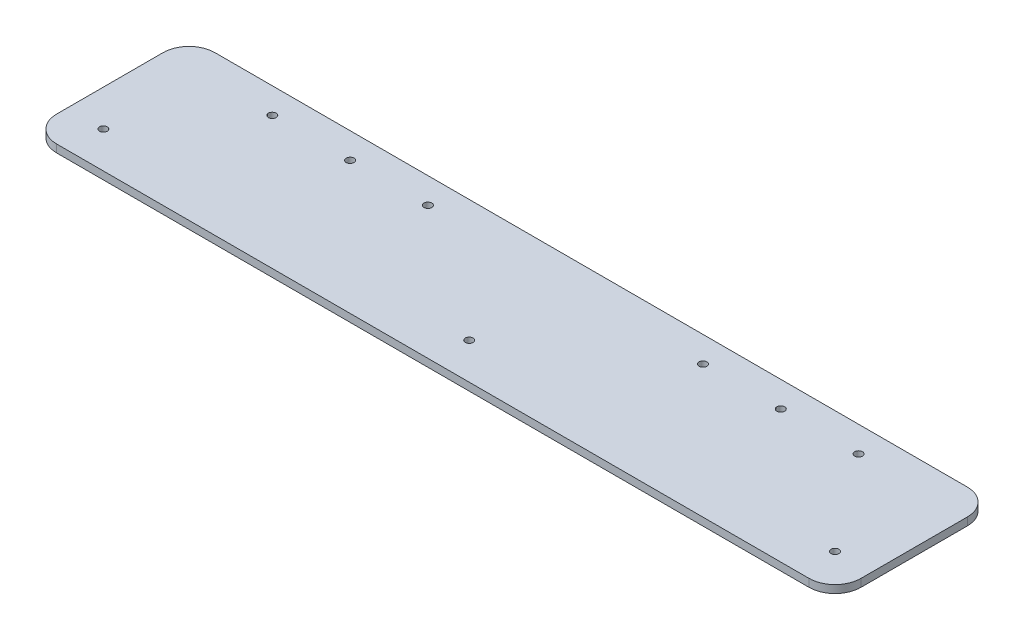
ISO-10303-21;
HEADER;
FILE_DESCRIPTION(('STEP AP214'),'2;1');
FILE_NAME('part.step','',(''),(''),'','','');
FILE_SCHEMA(('AUTOMOTIVE_DESIGN { 1 0 10303 214 1 1 1 1 }'));
ENDSEC;
DATA;
#1=APPLICATION_CONTEXT('core data for automotive mechanical design processes');
#2=APPLICATION_PROTOCOL_DEFINITION('international standard','automotive_design',2000,#1);
#3=PRODUCT_CONTEXT('',#1,'mechanical');
#4=PRODUCT('Part','Part','',(#3));
#5=PRODUCT_RELATED_PRODUCT_CATEGORY('part','',(#4));
#6=PRODUCT_DEFINITION_FORMATION('','',#4);
#7=PRODUCT_DEFINITION_CONTEXT('part definition',#1,'design');
#8=PRODUCT_DEFINITION('design','',#6,#7);
#9=PRODUCT_DEFINITION_SHAPE('','',#8);
#10=(LENGTH_UNIT() NAMED_UNIT(*) SI_UNIT(.MILLI.,.METRE.));
#11=(NAMED_UNIT(*) PLANE_ANGLE_UNIT() SI_UNIT($,.RADIAN.));
#12=(NAMED_UNIT(*) SI_UNIT($,.STERADIAN.) SOLID_ANGLE_UNIT());
#13=UNCERTAINTY_MEASURE_WITH_UNIT(LENGTH_MEASURE(1.E-05),#10,'distance_accuracy_value','');
#14=(GEOMETRIC_REPRESENTATION_CONTEXT(3) GLOBAL_UNCERTAINTY_ASSIGNED_CONTEXT((#13)) GLOBAL_UNIT_ASSIGNED_CONTEXT((#10,
#11,#12)) REPRESENTATION_CONTEXT('',''));
#15=CARTESIAN_POINT('',(0.,0.,0.));
#16=DIRECTION('',(0.,0.,1.));
#17=DIRECTION('',(1.,0.,0.));
#18=AXIS2_PLACEMENT_3D('',#15,#16,#17);
#19=CARTESIAN_POINT('',(10.,3.,210.));
#20=DIRECTION('',(0.,1.,0.));
#21=DIRECTION('',(0.,0.,1.));
#22=AXIS2_PLACEMENT_3D('',#19,#20,#21);
#23=PLANE('',#22);
#24=CARTESIAN_POINT('',(268.,3.,168.903225806451));
#25=DIRECTION('',(0.,1.,0.));
#26=DIRECTION('',(0.,0.,1.));
#27=AXIS2_PLACEMENT_3D('',#24,#25,#26);
#28=CIRCLE('',#27,1.49999999999996);
#29=CARTESIAN_POINT('',(268.,3.,170.403225806451));
#30=VERTEX_POINT('',#29);
#31=EDGE_CURVE('E261',#30,#30,#28,.T.);
#32=ORIENTED_EDGE('',*,*,#31,.F.);
#33=EDGE_LOOP('',(#32));
#34=FACE_BOUND('',#33,.T.);
#35=CARTESIAN_POINT('',(102.,3.,168.903225806452));
#36=DIRECTION('',(0.,1.,0.));
#37=DIRECTION('',(0.,0.,1.));
#38=AXIS2_PLACEMENT_3D('',#35,#36,#37);
#39=CIRCLE('',#38,1.5);
#40=CARTESIAN_POINT('',(102.,3.,170.403225806452));
#41=VERTEX_POINT('',#40);
#42=EDGE_CURVE('E245',#41,#41,#39,.T.);
#43=ORIENTED_EDGE('',*,*,#42,.F.);
#44=EDGE_LOOP('',(#43));
#45=FACE_BOUND('',#44,.T.);
#46=CARTESIAN_POINT('',(72.,3.,168.903225806452));
#47=DIRECTION('',(0.,1.,0.));
#48=DIRECTION('',(0.,0.,1.));
#49=AXIS2_PLACEMENT_3D('',#46,#47,#48);
#50=CIRCLE('',#49,1.5);
#51=CARTESIAN_POINT('',(72.,3.,170.403225806452));
#52=VERTEX_POINT('',#51);
#53=EDGE_CURVE('E229',#52,#52,#50,.T.);
#54=ORIENTED_EDGE('',*,*,#53,.F.);
#55=EDGE_LOOP('',(#54));
#56=FACE_BOUND('',#55,.T.);
#57=CARTESIAN_POINT('',(296.,3.,206.));
#58=DIRECTION('',(0.,1.,0.));
#59=DIRECTION('',(0.,0.,1.));
#60=AXIS2_PLACEMENT_3D('',#57,#58,#59);
#61=CIRCLE('',#60,1.49999999999996);
#62=CARTESIAN_POINT('',(296.,3.,207.5));
#63=VERTEX_POINT('',#62);
#64=EDGE_CURVE('E213',#63,#63,#61,.T.);
#65=ORIENTED_EDGE('',*,*,#64,.F.);
#66=EDGE_LOOP('',(#65));
#67=FACE_BOUND('',#66,.T.);
#68=CARTESIAN_POINT('',(10.,3.,210.));
#69=DIRECTION('',(0.,1.,0.));
#70=DIRECTION('',(0.,0.,1.));
#71=AXIS2_PLACEMENT_3D('',#68,#69,#70);
#72=CIRCLE('',#71,10.);
#73=CARTESIAN_POINT('',(0.,3.,210.));
#74=VERTEX_POINT('',#73);
#75=CARTESIAN_POINT('',(10.,3.,220.));
#76=VERTEX_POINT('',#75);
#77=EDGE_CURVE('E164',#74,#76,#72,.T.);
#78=ORIENTED_EDGE('',*,*,#77,.T.);
#79=DIRECTION('',(1.,0.,0.));
#80=VECTOR('',#79,1.);
#81=CARTESIAN_POINT('',(10.,3.,220.));
#82=LINE('',#81,#80);
#83=CARTESIAN_POINT('',(300.,3.,220.));
#84=VERTEX_POINT('',#83);
#85=EDGE_CURVE('E100',#76,#84,#82,.T.);
#86=ORIENTED_EDGE('',*,*,#85,.T.);
#87=CARTESIAN_POINT('',(300.,3.,210.));
#88=DIRECTION('',(0.,1.,0.));
#89=DIRECTION('',(0.,0.,1.));
#90=AXIS2_PLACEMENT_3D('',#87,#88,#89);
#91=CIRCLE('',#90,9.99999999999994);
#92=CARTESIAN_POINT('',(310.,3.,210.));
#93=VERTEX_POINT('',#92);
#94=EDGE_CURVE('E185',#84,#93,#91,.T.);
#95=ORIENTED_EDGE('',*,*,#94,.T.);
#96=DIRECTION('',(0.,0.,-1.));
#97=VECTOR('',#96,1.);
#98=CARTESIAN_POINT('',(310.,3.,169.));
#99=LINE('',#98,#97);
#100=CARTESIAN_POINT('',(310.,3.,169.));
#101=VERTEX_POINT('',#100);
#102=EDGE_CURVE('E199',#93,#101,#99,.T.);
#103=ORIENTED_EDGE('',*,*,#102,.T.);
#104=CARTESIAN_POINT('',(300.,3.,169.));
#105=DIRECTION('',(0.,1.,0.));
#106=DIRECTION('',(0.,0.,1.));
#107=AXIS2_PLACEMENT_3D('',#104,#105,#106);
#108=CIRCLE('',#107,10.);
#109=CARTESIAN_POINT('',(300.,3.,159.));
#110=VERTEX_POINT('',#109);
#111=EDGE_CURVE('E119',#101,#110,#108,.T.);
#112=ORIENTED_EDGE('',*,*,#111,.T.);
#113=DIRECTION('',(-1.,0.,0.));
#114=VECTOR('',#113,1.);
#115=CARTESIAN_POINT('',(10.0000000000001,3.,159.));
#116=LINE('',#115,#114);
#117=CARTESIAN_POINT('',(10.0000000000001,3.,159.));
#118=VERTEX_POINT('',#117);
#119=EDGE_CURVE('E113',#110,#118,#116,.T.);
#120=ORIENTED_EDGE('',*,*,#119,.T.);
#121=CARTESIAN_POINT('',(10.,3.,169.));
#122=DIRECTION('',(0.,1.,0.));
#123=DIRECTION('',(0.,0.,1.));
#124=AXIS2_PLACEMENT_3D('',#121,#122,#123);
#125=CIRCLE('',#124,10.);
#126=CARTESIAN_POINT('',(0.,3.,169.));
#127=VERTEX_POINT('',#126);
#128=EDGE_CURVE('E117',#118,#127,#125,.T.);
#129=ORIENTED_EDGE('',*,*,#128,.T.);
#130=DIRECTION('',(0.,0.,1.));
#131=VECTOR('',#130,1.);
#132=CARTESIAN_POINT('',(0.,3.,169.));
#133=LINE('',#132,#131);
#134=EDGE_CURVE('E57',#127,#74,#133,.T.);
#135=ORIENTED_EDGE('',*,*,#134,.T.);
#136=EDGE_LOOP('',(#78,#86,#95,#103,#112,#120,#129,#135));
#137=FACE_BOUND('',#136,.T.);
#138=CARTESIAN_POINT('',(14.,3.,206.));
#139=DIRECTION('',(0.,1.,0.));
#140=DIRECTION('',(0.,0.,1.));
#141=AXIS2_PLACEMENT_3D('',#138,#139,#140);
#142=CIRCLE('',#141,1.5);
#143=CARTESIAN_POINT('',(14.,3.,207.5));
#144=VERTEX_POINT('',#143);
#145=EDGE_CURVE('E146',#144,#144,#142,.T.);
#146=ORIENTED_EDGE('',*,*,#145,.F.);
#147=EDGE_LOOP('',(#146));
#148=FACE_BOUND('',#147,.T.);
#149=CARTESIAN_POINT('',(155.,3.,206.));
#150=DIRECTION('',(0.,1.,0.));
#151=DIRECTION('',(0.,0.,1.));
#152=AXIS2_PLACEMENT_3D('',#149,#150,#151);
#153=CIRCLE('',#152,1.5);
#154=CARTESIAN_POINT('',(155.,3.,207.5));
#155=VERTEX_POINT('',#154);
#156=EDGE_CURVE('E221',#155,#155,#153,.T.);
#157=ORIENTED_EDGE('',*,*,#156,.F.);
#158=EDGE_LOOP('',(#157));
#159=FACE_BOUND('',#158,.T.);
#160=CARTESIAN_POINT('',(42.,3.,168.903225806452));
#161=DIRECTION('',(0.,1.,0.));
#162=DIRECTION('',(0.,0.,1.));
#163=AXIS2_PLACEMENT_3D('',#160,#161,#162);
#164=CIRCLE('',#163,1.5);
#165=CARTESIAN_POINT('',(42.,3.,170.403225806452));
#166=VERTEX_POINT('',#165);
#167=EDGE_CURVE('E237',#166,#166,#164,.T.);
#168=ORIENTED_EDGE('',*,*,#167,.F.);
#169=EDGE_LOOP('',(#168));
#170=FACE_BOUND('',#169,.T.);
#171=CARTESIAN_POINT('',(238.,3.,168.903225806451));
#172=DIRECTION('',(0.,1.,0.));
#173=DIRECTION('',(0.,0.,1.));
#174=AXIS2_PLACEMENT_3D('',#171,#172,#173);
#175=CIRCLE('',#174,1.49999999999996);
#176=CARTESIAN_POINT('',(238.,3.,170.403225806451));
#177=VERTEX_POINT('',#176);
#178=EDGE_CURVE('E253',#177,#177,#175,.T.);
#179=ORIENTED_EDGE('',*,*,#178,.F.);
#180=EDGE_LOOP('',(#179));
#181=FACE_BOUND('',#180,.T.);
#182=CARTESIAN_POINT('',(208.,3.,168.903225806451));
#183=DIRECTION('',(0.,1.,0.));
#184=DIRECTION('',(0.,0.,1.));
#185=AXIS2_PLACEMENT_3D('',#182,#183,#184);
#186=CIRCLE('',#185,1.49999999999995);
#187=CARTESIAN_POINT('',(208.,3.,170.403225806451));
#188=VERTEX_POINT('',#187);
#189=EDGE_CURVE('E269',#188,#188,#186,.T.);
#190=ORIENTED_EDGE('',*,*,#189,.F.);
#191=EDGE_LOOP('',(#190));
#192=FACE_BOUND('',#191,.T.);
#193=ADVANCED_FACE('F39',(#34,#45,#56,#67,#137,#148,#159,#170,#181,#192),#23,.T.);
#194=CARTESIAN_POINT('',(10.,0.,210.));
#195=DIRECTION('',(0.,1.,0.));
#196=DIRECTION('',(0.,0.,1.));
#197=AXIS2_PLACEMENT_3D('',#194,#195,#196);
#198=PLANE('',#197);
#199=CARTESIAN_POINT('',(10.,0.,210.));
#200=DIRECTION('',(0.,1.,0.));
#201=DIRECTION('',(0.,0.,1.));
#202=AXIS2_PLACEMENT_3D('',#199,#200,#201);
#203=CIRCLE('',#202,10.);
#204=CARTESIAN_POINT('',(0.,0.,210.));
#205=VERTEX_POINT('',#204);
#206=CARTESIAN_POINT('',(10.,0.,220.));
#207=VERTEX_POINT('',#206);
#208=EDGE_CURVE('E141',#205,#207,#203,.T.);
#209=ORIENTED_EDGE('',*,*,#208,.F.);
#210=DIRECTION('',(0.,0.,1.));
#211=VECTOR('',#210,1.);
#212=CARTESIAN_POINT('',(0.,0.,169.));
#213=LINE('',#212,#211);
#214=CARTESIAN_POINT('',(0.,0.,169.));
#215=VERTEX_POINT('',#214);
#216=EDGE_CURVE('E92',#215,#205,#213,.T.);
#217=ORIENTED_EDGE('',*,*,#216,.F.);
#218=CARTESIAN_POINT('',(10.,0.,169.));
#219=DIRECTION('',(0.,1.,0.));
#220=DIRECTION('',(0.,0.,1.));
#221=AXIS2_PLACEMENT_3D('',#218,#219,#220);
#222=CIRCLE('',#221,10.);
#223=CARTESIAN_POINT('',(10.0000000000001,0.,159.));
#224=VERTEX_POINT('',#223);
#225=EDGE_CURVE('E86',#224,#215,#222,.T.);
#226=ORIENTED_EDGE('',*,*,#225,.F.);
#227=DIRECTION('',(-1.,0.,0.));
#228=VECTOR('',#227,1.);
#229=CARTESIAN_POINT('',(10.0000000000001,0.,159.));
#230=LINE('',#229,#228);
#231=CARTESIAN_POINT('',(300.,0.,159.));
#232=VERTEX_POINT('',#231);
#233=EDGE_CURVE('E128',#232,#224,#230,.T.);
#234=ORIENTED_EDGE('',*,*,#233,.F.);
#235=CARTESIAN_POINT('',(300.,0.,169.));
#236=DIRECTION('',(0.,1.,0.));
#237=DIRECTION('',(0.,0.,1.));
#238=AXIS2_PLACEMENT_3D('',#235,#236,#237);
#239=CIRCLE('',#238,10.);
#240=CARTESIAN_POINT('',(310.,0.,169.));
#241=VERTEX_POINT('',#240);
#242=EDGE_CURVE('E155',#241,#232,#239,.T.);
#243=ORIENTED_EDGE('',*,*,#242,.F.);
#244=DIRECTION('',(0.,0.,-1.));
#245=VECTOR('',#244,1.);
#246=CARTESIAN_POINT('',(310.,0.,169.));
#247=LINE('',#246,#245);
#248=CARTESIAN_POINT('',(310.,0.,210.));
#249=VERTEX_POINT('',#248);
#250=EDGE_CURVE('E152',#249,#241,#247,.T.);
#251=ORIENTED_EDGE('',*,*,#250,.F.);
#252=CARTESIAN_POINT('',(300.,0.,210.));
#253=DIRECTION('',(0.,1.,0.));
#254=DIRECTION('',(0.,0.,1.));
#255=AXIS2_PLACEMENT_3D('',#252,#253,#254);
#256=CIRCLE('',#255,9.99999999999994);
#257=CARTESIAN_POINT('',(300.,0.,220.));
#258=VERTEX_POINT('',#257);
#259=EDGE_CURVE('E149',#258,#249,#256,.T.);
#260=ORIENTED_EDGE('',*,*,#259,.F.);
#261=DIRECTION('',(1.,0.,0.));
#262=VECTOR('',#261,1.);
#263=CARTESIAN_POINT('',(10.,0.,220.));
#264=LINE('',#263,#262);
#265=EDGE_CURVE('E145',#207,#258,#264,.T.);
#266=ORIENTED_EDGE('',*,*,#265,.F.);
#267=EDGE_LOOP('',(#209,#217,#226,#234,#243,#251,#260,#266));
#268=FACE_BOUND('',#267,.T.);
#269=CARTESIAN_POINT('',(14.,0.,206.));
#270=DIRECTION('',(0.,1.,0.));
#271=DIRECTION('',(0.,0.,1.));
#272=AXIS2_PLACEMENT_3D('',#269,#270,#271);
#273=CIRCLE('',#272,1.5);
#274=CARTESIAN_POINT('',(14.,0.,207.5));
#275=VERTEX_POINT('',#274);
#276=EDGE_CURVE('E209',#275,#275,#273,.T.);
#277=ORIENTED_EDGE('',*,*,#276,.T.);
#278=EDGE_LOOP('',(#277));
#279=FACE_BOUND('',#278,.T.);
#280=CARTESIAN_POINT('',(296.,0.,206.));
#281=DIRECTION('',(0.,1.,0.));
#282=DIRECTION('',(0.,0.,1.));
#283=AXIS2_PLACEMENT_3D('',#280,#281,#282);
#284=CIRCLE('',#283,1.49999999999996);
#285=CARTESIAN_POINT('',(296.,0.,207.5));
#286=VERTEX_POINT('',#285);
#287=EDGE_CURVE('E217',#286,#286,#284,.T.);
#288=ORIENTED_EDGE('',*,*,#287,.T.);
#289=EDGE_LOOP('',(#288));
#290=FACE_BOUND('',#289,.T.);
#291=CARTESIAN_POINT('',(155.,0.,206.));
#292=DIRECTION('',(0.,1.,0.));
#293=DIRECTION('',(0.,0.,1.));
#294=AXIS2_PLACEMENT_3D('',#291,#292,#293);
#295=CIRCLE('',#294,1.5);
#296=CARTESIAN_POINT('',(155.,0.,207.5));
#297=VERTEX_POINT('',#296);
#298=EDGE_CURVE('E225',#297,#297,#295,.T.);
#299=ORIENTED_EDGE('',*,*,#298,.T.);
#300=EDGE_LOOP('',(#299));
#301=FACE_BOUND('',#300,.T.);
#302=CARTESIAN_POINT('',(72.,0.,168.903225806452));
#303=DIRECTION('',(0.,1.,0.));
#304=DIRECTION('',(0.,0.,1.));
#305=AXIS2_PLACEMENT_3D('',#302,#303,#304);
#306=CIRCLE('',#305,1.5);
#307=CARTESIAN_POINT('',(72.,0.,170.403225806452));
#308=VERTEX_POINT('',#307);
#309=EDGE_CURVE('E233',#308,#308,#306,.T.);
#310=ORIENTED_EDGE('',*,*,#309,.T.);
#311=EDGE_LOOP('',(#310));
#312=FACE_BOUND('',#311,.T.);
#313=CARTESIAN_POINT('',(42.,0.,168.903225806452));
#314=DIRECTION('',(0.,1.,0.));
#315=DIRECTION('',(0.,0.,1.));
#316=AXIS2_PLACEMENT_3D('',#313,#314,#315);
#317=CIRCLE('',#316,1.5);
#318=CARTESIAN_POINT('',(42.,0.,170.403225806452));
#319=VERTEX_POINT('',#318);
#320=EDGE_CURVE('E241',#319,#319,#317,.T.);
#321=ORIENTED_EDGE('',*,*,#320,.T.);
#322=EDGE_LOOP('',(#321));
#323=FACE_BOUND('',#322,.T.);
#324=CARTESIAN_POINT('',(102.,0.,168.903225806452));
#325=DIRECTION('',(0.,1.,0.));
#326=DIRECTION('',(0.,0.,1.));
#327=AXIS2_PLACEMENT_3D('',#324,#325,#326);
#328=CIRCLE('',#327,1.5);
#329=CARTESIAN_POINT('',(102.,0.,170.403225806452));
#330=VERTEX_POINT('',#329);
#331=EDGE_CURVE('E249',#330,#330,#328,.T.);
#332=ORIENTED_EDGE('',*,*,#331,.T.);
#333=EDGE_LOOP('',(#332));
#334=FACE_BOUND('',#333,.T.);
#335=CARTESIAN_POINT('',(238.,0.,168.903225806451));
#336=DIRECTION('',(0.,1.,0.));
#337=DIRECTION('',(0.,0.,1.));
#338=AXIS2_PLACEMENT_3D('',#335,#336,#337);
#339=CIRCLE('',#338,1.49999999999996);
#340=CARTESIAN_POINT('',(238.,0.,170.403225806451));
#341=VERTEX_POINT('',#340);
#342=EDGE_CURVE('E257',#341,#341,#339,.T.);
#343=ORIENTED_EDGE('',*,*,#342,.T.);
#344=EDGE_LOOP('',(#343));
#345=FACE_BOUND('',#344,.T.);
#346=CARTESIAN_POINT('',(268.,0.,168.903225806451));
#347=DIRECTION('',(0.,1.,0.));
#348=DIRECTION('',(0.,0.,1.));
#349=AXIS2_PLACEMENT_3D('',#346,#347,#348);
#350=CIRCLE('',#349,1.49999999999996);
#351=CARTESIAN_POINT('',(268.,0.,170.403225806451));
#352=VERTEX_POINT('',#351);
#353=EDGE_CURVE('E265',#352,#352,#350,.T.);
#354=ORIENTED_EDGE('',*,*,#353,.T.);
#355=EDGE_LOOP('',(#354));
#356=FACE_BOUND('',#355,.T.);
#357=CARTESIAN_POINT('',(208.,0.,168.903225806451));
#358=DIRECTION('',(0.,1.,0.));
#359=DIRECTION('',(0.,0.,1.));
#360=AXIS2_PLACEMENT_3D('',#357,#358,#359);
#361=CIRCLE('',#360,1.49999999999995);
#362=CARTESIAN_POINT('',(208.,0.,170.403225806451));
#363=VERTEX_POINT('',#362);
#364=EDGE_CURVE('E273',#363,#363,#361,.T.);
#365=ORIENTED_EDGE('',*,*,#364,.T.);
#366=EDGE_LOOP('',(#365));
#367=FACE_BOUND('',#366,.T.);
#368=ADVANCED_FACE('F189',(#268,#279,#290,#301,#312,#323,#334,#345,#356,#367),#198,.F.);
#369=CARTESIAN_POINT('',(10.,3.,210.));
#370=DIRECTION('',(0.,-1.,0.));
#371=DIRECTION('',(0.,0.,-1.));
#372=AXIS2_PLACEMENT_3D('',#369,#370,#371);
#373=CYLINDRICAL_SURFACE('',#372,10.);
#374=ORIENTED_EDGE('',*,*,#208,.T.);
#375=DIRECTION('',(0.,-1.,0.));
#376=VECTOR('',#375,1.);
#377=CARTESIAN_POINT('',(10.,3.,220.));
#378=LINE('',#377,#376);
#379=EDGE_CURVE('E11',#76,#207,#378,.T.);
#380=ORIENTED_EDGE('',*,*,#379,.F.);
#381=ORIENTED_EDGE('',*,*,#77,.F.);
#382=DIRECTION('',(0.,-1.,0.));
#383=VECTOR('',#382,1.);
#384=CARTESIAN_POINT('',(0.,3.,210.));
#385=LINE('',#384,#383);
#386=EDGE_CURVE('E137',#74,#205,#385,.T.);
#387=ORIENTED_EDGE('',*,*,#386,.T.);
#388=EDGE_LOOP('',(#374,#380,#381,#387));
#389=FACE_BOUND('',#388,.T.);
#390=ADVANCED_FACE('F41',(#389),#373,.T.);
#391=CARTESIAN_POINT('',(10.,3.,220.));
#392=DIRECTION('',(0.,0.,-1.));
#393=DIRECTION('',(-1.,0.,0.));
#394=AXIS2_PLACEMENT_3D('',#391,#392,#393);
#395=PLANE('',#394);
#396=ORIENTED_EDGE('',*,*,#265,.T.);
#397=DIRECTION('',(0.,-1.,0.));
#398=VECTOR('',#397,1.);
#399=CARTESIAN_POINT('',(300.,3.,220.));
#400=LINE('',#399,#398);
#401=EDGE_CURVE('E49',#84,#258,#400,.T.);
#402=ORIENTED_EDGE('',*,*,#401,.F.);
#403=ORIENTED_EDGE('',*,*,#85,.F.);
#404=ORIENTED_EDGE('',*,*,#379,.T.);
#405=EDGE_LOOP('',(#396,#402,#403,#404));
#406=FACE_BOUND('',#405,.T.);
#407=ADVANCED_FACE('F309',(#406),#395,.F.);
#408=CARTESIAN_POINT('',(300.,3.,210.));
#409=DIRECTION('',(0.,-1.,0.));
#410=DIRECTION('',(0.,0.,-1.));
#411=AXIS2_PLACEMENT_3D('',#408,#409,#410);
#412=CYLINDRICAL_SURFACE('',#411,9.99999999999994);
#413=ORIENTED_EDGE('',*,*,#259,.T.);
#414=DIRECTION('',(0.,-1.,0.));
#415=VECTOR('',#414,1.);
#416=CARTESIAN_POINT('',(310.,3.,210.));
#417=LINE('',#416,#415);
#418=EDGE_CURVE('E175',#93,#249,#417,.T.);
#419=ORIENTED_EDGE('',*,*,#418,.F.);
#420=ORIENTED_EDGE('',*,*,#94,.F.);
#421=ORIENTED_EDGE('',*,*,#401,.T.);
#422=EDGE_LOOP('',(#413,#419,#420,#421));
#423=FACE_BOUND('',#422,.T.);
#424=ADVANCED_FACE('F183',(#423),#412,.T.);
#425=CARTESIAN_POINT('',(310.,3.,169.));
#426=DIRECTION('',(-1.,0.,0.));
#427=DIRECTION('',(0.,0.,1.));
#428=AXIS2_PLACEMENT_3D('',#425,#426,#427);
#429=PLANE('',#428);
#430=ORIENTED_EDGE('',*,*,#250,.T.);
#431=DIRECTION('',(0.,-1.,0.));
#432=VECTOR('',#431,1.);
#433=CARTESIAN_POINT('',(310.,3.,169.));
#434=LINE('',#433,#432);
#435=EDGE_CURVE('E171',#101,#241,#434,.T.);
#436=ORIENTED_EDGE('',*,*,#435,.F.);
#437=ORIENTED_EDGE('',*,*,#102,.F.);
#438=ORIENTED_EDGE('',*,*,#418,.T.);
#439=EDGE_LOOP('',(#430,#436,#437,#438));
#440=FACE_BOUND('',#439,.T.);
#441=ADVANCED_FACE('F194',(#440),#429,.F.);
#442=CARTESIAN_POINT('',(300.,3.,169.));
#443=DIRECTION('',(0.,-1.,0.));
#444=DIRECTION('',(0.,0.,-1.));
#445=AXIS2_PLACEMENT_3D('',#442,#443,#444);
#446=CYLINDRICAL_SURFACE('',#445,10.);
#447=ORIENTED_EDGE('',*,*,#242,.T.);
#448=DIRECTION('',(0.,-1.,0.));
#449=VECTOR('',#448,1.);
#450=CARTESIAN_POINT('',(300.,3.,159.));
#451=LINE('',#450,#449);
#452=EDGE_CURVE('E130',#110,#232,#451,.T.);
#453=ORIENTED_EDGE('',*,*,#452,.F.);
#454=ORIENTED_EDGE('',*,*,#111,.F.);
#455=ORIENTED_EDGE('',*,*,#435,.T.);
#456=EDGE_LOOP('',(#447,#453,#454,#455));
#457=FACE_BOUND('',#456,.T.);
#458=ADVANCED_FACE('F197',(#457),#446,.T.);
#459=CARTESIAN_POINT('',(10.0000000000001,3.,159.));
#460=DIRECTION('',(0.,0.,1.));
#461=DIRECTION('',(1.,0.,0.));
#462=AXIS2_PLACEMENT_3D('',#459,#460,#461);
#463=PLANE('',#462);
#464=ORIENTED_EDGE('',*,*,#233,.T.);
#465=DIRECTION('',(0.,-1.,0.));
#466=VECTOR('',#465,1.);
#467=CARTESIAN_POINT('',(10.0000000000001,3.,159.));
#468=LINE('',#467,#466);
#469=EDGE_CURVE('E125',#118,#224,#468,.T.);
#470=ORIENTED_EDGE('',*,*,#469,.F.);
#471=ORIENTED_EDGE('',*,*,#119,.F.);
#472=ORIENTED_EDGE('',*,*,#452,.T.);
#473=EDGE_LOOP('',(#464,#470,#471,#472));
#474=FACE_BOUND('',#473,.T.);
#475=ADVANCED_FACE('F126',(#474),#463,.F.);
#476=CARTESIAN_POINT('',(10.,3.,169.));
#477=DIRECTION('',(0.,-1.,0.));
#478=DIRECTION('',(0.,0.,-1.));
#479=AXIS2_PLACEMENT_3D('',#476,#477,#478);
#480=CYLINDRICAL_SURFACE('',#479,10.);
#481=ORIENTED_EDGE('',*,*,#225,.T.);
#482=DIRECTION('',(0.,-1.,0.));
#483=VECTOR('',#482,1.);
#484=CARTESIAN_POINT('',(0.,3.,169.));
#485=LINE('',#484,#483);
#486=EDGE_CURVE('E131',#127,#215,#485,.T.);
#487=ORIENTED_EDGE('',*,*,#486,.F.);
#488=ORIENTED_EDGE('',*,*,#128,.F.);
#489=ORIENTED_EDGE('',*,*,#469,.T.);
#490=EDGE_LOOP('',(#481,#487,#488,#489));
#491=FACE_BOUND('',#490,.T.);
#492=ADVANCED_FACE('F133',(#491),#480,.T.);
#493=CARTESIAN_POINT('',(0.,3.,169.));
#494=DIRECTION('',(1.,0.,0.));
#495=DIRECTION('',(0.,0.,-1.));
#496=AXIS2_PLACEMENT_3D('',#493,#494,#495);
#497=PLANE('',#496);
#498=ORIENTED_EDGE('',*,*,#216,.T.);
#499=ORIENTED_EDGE('',*,*,#386,.F.);
#500=ORIENTED_EDGE('',*,*,#134,.F.);
#501=ORIENTED_EDGE('',*,*,#486,.T.);
#502=EDGE_LOOP('',(#498,#499,#500,#501));
#503=FACE_BOUND('',#502,.T.);
#504=ADVANCED_FACE('F297',(#503),#497,.F.);
#505=CARTESIAN_POINT('',(14.,3.,206.));
#506=DIRECTION('',(0.,-1.,0.));
#507=DIRECTION('',(0.,0.,-1.));
#508=AXIS2_PLACEMENT_3D('',#505,#506,#507);
#509=CYLINDRICAL_SURFACE('',#508,1.5);
#510=ORIENTED_EDGE('',*,*,#145,.T.);
#511=EDGE_LOOP('',(#510));
#512=FACE_BOUND('',#511,.T.);
#513=ORIENTED_EDGE('',*,*,#276,.F.);
#514=EDGE_LOOP('',(#513));
#515=FACE_BOUND('',#514,.T.);
#516=ADVANCED_FACE('F294',(#512,#515),#509,.F.);
#517=CARTESIAN_POINT('',(296.,3.,206.));
#518=DIRECTION('',(0.,-1.,0.));
#519=DIRECTION('',(0.,0.,-1.));
#520=AXIS2_PLACEMENT_3D('',#517,#518,#519);
#521=CYLINDRICAL_SURFACE('',#520,1.49999999999996);
#522=ORIENTED_EDGE('',*,*,#64,.T.);
#523=EDGE_LOOP('',(#522));
#524=FACE_BOUND('',#523,.T.);
#525=ORIENTED_EDGE('',*,*,#287,.F.);
#526=EDGE_LOOP('',(#525));
#527=FACE_BOUND('',#526,.T.);
#528=ADVANCED_FACE('F373',(#524,#527),#521,.F.);
#529=CARTESIAN_POINT('',(155.,3.,206.));
#530=DIRECTION('',(0.,-1.,0.));
#531=DIRECTION('',(0.,0.,-1.));
#532=AXIS2_PLACEMENT_3D('',#529,#530,#531);
#533=CYLINDRICAL_SURFACE('',#532,1.5);
#534=ORIENTED_EDGE('',*,*,#156,.T.);
#535=EDGE_LOOP('',(#534));
#536=FACE_BOUND('',#535,.T.);
#537=ORIENTED_EDGE('',*,*,#298,.F.);
#538=EDGE_LOOP('',(#537));
#539=FACE_BOUND('',#538,.T.);
#540=ADVANCED_FACE('F381',(#536,#539),#533,.F.);
#541=CARTESIAN_POINT('',(72.,3.,168.903225806452));
#542=DIRECTION('',(0.,-1.,0.));
#543=DIRECTION('',(0.,0.,-1.));
#544=AXIS2_PLACEMENT_3D('',#541,#542,#543);
#545=CYLINDRICAL_SURFACE('',#544,1.5);
#546=ORIENTED_EDGE('',*,*,#53,.T.);
#547=EDGE_LOOP('',(#546));
#548=FACE_BOUND('',#547,.T.);
#549=ORIENTED_EDGE('',*,*,#309,.F.);
#550=EDGE_LOOP('',(#549));
#551=FACE_BOUND('',#550,.T.);
#552=ADVANCED_FACE('F389',(#548,#551),#545,.F.);
#553=CARTESIAN_POINT('',(42.,3.,168.903225806452));
#554=DIRECTION('',(0.,-1.,0.));
#555=DIRECTION('',(0.,0.,-1.));
#556=AXIS2_PLACEMENT_3D('',#553,#554,#555);
#557=CYLINDRICAL_SURFACE('',#556,1.5);
#558=ORIENTED_EDGE('',*,*,#167,.T.);
#559=EDGE_LOOP('',(#558));
#560=FACE_BOUND('',#559,.T.);
#561=ORIENTED_EDGE('',*,*,#320,.F.);
#562=EDGE_LOOP('',(#561));
#563=FACE_BOUND('',#562,.T.);
#564=ADVANCED_FACE('F398',(#560,#563),#557,.F.);
#565=CARTESIAN_POINT('',(102.,3.,168.903225806452));
#566=DIRECTION('',(0.,-1.,0.));
#567=DIRECTION('',(0.,0.,-1.));
#568=AXIS2_PLACEMENT_3D('',#565,#566,#567);
#569=CYLINDRICAL_SURFACE('',#568,1.5);
#570=ORIENTED_EDGE('',*,*,#42,.T.);
#571=EDGE_LOOP('',(#570));
#572=FACE_BOUND('',#571,.T.);
#573=ORIENTED_EDGE('',*,*,#331,.F.);
#574=EDGE_LOOP('',(#573));
#575=FACE_BOUND('',#574,.T.);
#576=ADVANCED_FACE('F407',(#572,#575),#569,.F.);
#577=CARTESIAN_POINT('',(238.,3.,168.903225806451));
#578=DIRECTION('',(0.,-1.,0.));
#579=DIRECTION('',(0.,0.,-1.));
#580=AXIS2_PLACEMENT_3D('',#577,#578,#579);
#581=CYLINDRICAL_SURFACE('',#580,1.49999999999996);
#582=ORIENTED_EDGE('',*,*,#178,.T.);
#583=EDGE_LOOP('',(#582));
#584=FACE_BOUND('',#583,.T.);
#585=ORIENTED_EDGE('',*,*,#342,.F.);
#586=EDGE_LOOP('',(#585));
#587=FACE_BOUND('',#586,.T.);
#588=ADVANCED_FACE('F416',(#584,#587),#581,.F.);
#589=CARTESIAN_POINT('',(268.,3.,168.903225806451));
#590=DIRECTION('',(0.,-1.,0.));
#591=DIRECTION('',(0.,0.,-1.));
#592=AXIS2_PLACEMENT_3D('',#589,#590,#591);
#593=CYLINDRICAL_SURFACE('',#592,1.49999999999996);
#594=ORIENTED_EDGE('',*,*,#31,.T.);
#595=EDGE_LOOP('',(#594));
#596=FACE_BOUND('',#595,.T.);
#597=ORIENTED_EDGE('',*,*,#353,.F.);
#598=EDGE_LOOP('',(#597));
#599=FACE_BOUND('',#598,.T.);
#600=ADVANCED_FACE('F425',(#596,#599),#593,.F.);
#601=CARTESIAN_POINT('',(208.,3.,168.903225806451));
#602=DIRECTION('',(0.,-1.,0.));
#603=DIRECTION('',(0.,0.,-1.));
#604=AXIS2_PLACEMENT_3D('',#601,#602,#603);
#605=CYLINDRICAL_SURFACE('',#604,1.49999999999995);
#606=ORIENTED_EDGE('',*,*,#189,.T.);
#607=EDGE_LOOP('',(#606));
#608=FACE_BOUND('',#607,.T.);
#609=ORIENTED_EDGE('',*,*,#364,.F.);
#610=EDGE_LOOP('',(#609));
#611=FACE_BOUND('',#610,.T.);
#612=ADVANCED_FACE('F281',(#608,#611),#605,.F.);
#613=CLOSED_SHELL('',(#193,#368,#390,#407,#424,#441,#458,#475,#492,#504,#516,#528,#540,#552,
#564,#576,#588,#600,#612));
#614=MANIFOLD_SOLID_BREP('B2',#613);
#615=ADVANCED_BREP_SHAPE_REPRESENTATION('',(#18,#614),#14);
#616=SHAPE_DEFINITION_REPRESENTATION(#9,#615);
ENDSEC;
END-ISO-10303-21;
